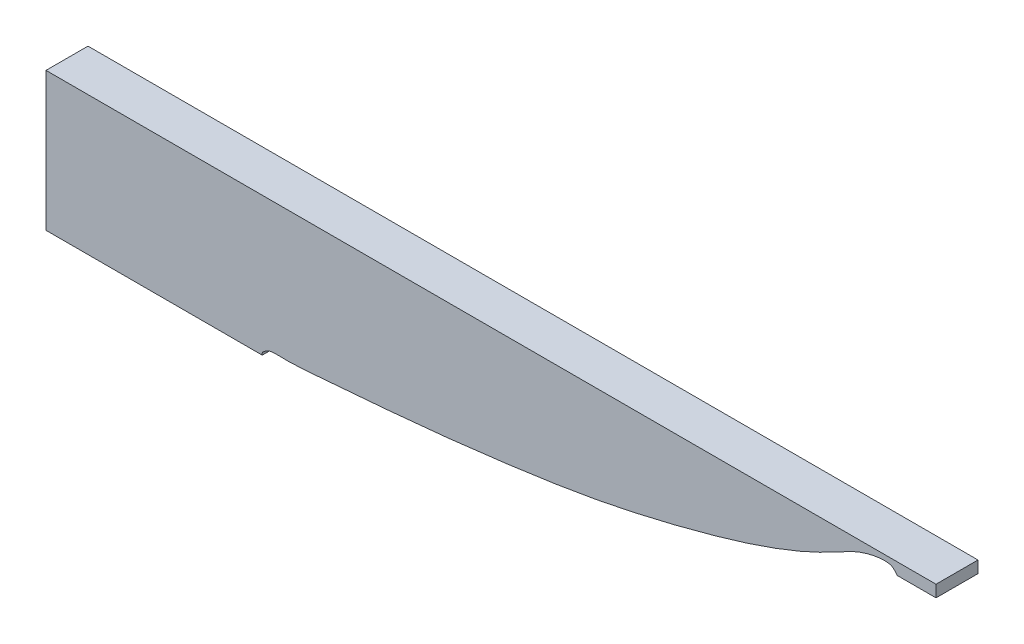
ISO-10303-21;
HEADER;
FILE_DESCRIPTION(('STEP AP214'),'2;1');
FILE_NAME('part.step','',(''),(''),'','','');
FILE_SCHEMA(('AUTOMOTIVE_DESIGN { 1 0 10303 214 1 1 1 1 }'));
ENDSEC;
DATA;
#1=APPLICATION_CONTEXT('core data for automotive mechanical design processes');
#2=APPLICATION_PROTOCOL_DEFINITION('international standard','automotive_design',2000,#1);
#3=PRODUCT_CONTEXT('',#1,'mechanical');
#4=PRODUCT('Part','Part','',(#3));
#5=PRODUCT_RELATED_PRODUCT_CATEGORY('part','',(#4));
#6=PRODUCT_DEFINITION_FORMATION('','',#4);
#7=PRODUCT_DEFINITION_CONTEXT('part definition',#1,'design');
#8=PRODUCT_DEFINITION('design','',#6,#7);
#9=PRODUCT_DEFINITION_SHAPE('','',#8);
#10=(LENGTH_UNIT() NAMED_UNIT(*) SI_UNIT(.MILLI.,.METRE.));
#11=(NAMED_UNIT(*) PLANE_ANGLE_UNIT() SI_UNIT($,.RADIAN.));
#12=(NAMED_UNIT(*) SI_UNIT($,.STERADIAN.) SOLID_ANGLE_UNIT());
#13=UNCERTAINTY_MEASURE_WITH_UNIT(LENGTH_MEASURE(1.E-05),#10,'distance_accuracy_value','');
#14=(GEOMETRIC_REPRESENTATION_CONTEXT(3) GLOBAL_UNCERTAINTY_ASSIGNED_CONTEXT((#13)) GLOBAL_UNIT_ASSIGNED_CONTEXT((#10,
#11,#12)) REPRESENTATION_CONTEXT('',''));
#15=CARTESIAN_POINT('',(0.,0.,0.));
#16=DIRECTION('',(0.,0.,1.));
#17=DIRECTION('',(1.,0.,0.));
#18=AXIS2_PLACEMENT_3D('',#15,#16,#17);
#19=CARTESIAN_POINT('',(-52.949019746504,-24.1447954127009,380.));
#20=CARTESIAN_POINT('',(-52.9645912690891,-24.0636870278323,380.));
#21=CARTESIAN_POINT('',(-52.9783340736109,-23.9816324531939,380.));
#22=CARTESIAN_POINT('',(-52.9706783281911,-23.8172747566796,380.));
#23=CARTESIAN_POINT('',(-52.9498647700014,-23.7356268511588,380.));
#24=CARTESIAN_POINT('',(-52.8721858628388,-23.5884918411596,380.));
#25=CARTESIAN_POINT('',(-52.8145393103514,-23.5281535278229,380.));
#26=CARTESIAN_POINT('',(-52.687959603608,-23.4211056938656,380.));
#27=CARTESIAN_POINT('',(-52.6222075283378,-23.3706398008123,380.));
#28=CARTESIAN_POINT('',(-52.4254051263337,-23.2186784827459,380.));
#29=CARTESIAN_POINT('',(-52.2901695526242,-23.1238753533858,380.));
#30=CARTESIAN_POINT('',(-52.0067089254694,-22.9558595882656,380.));
#31=CARTESIAN_POINT('',(-51.8547406035593,-22.8844174078812,380.));
#32=CARTESIAN_POINT('',(-51.3881074748697,-22.7252156486458,380.));
#33=CARTESIAN_POINT('',(-51.0676899061673,-22.6814838793278,380.));
#34=CARTESIAN_POINT('',(-50.4203854515145,-22.6372951883515,380.));
#35=CARTESIAN_POINT('',(-50.093101803306,-22.6368332538936,380.));
#36=CARTESIAN_POINT('',(-49.4400787308051,-22.6509629684589,380.));
#37=CARTESIAN_POINT('',(-49.1136071780461,-22.6654536250301,380.));
#38=CARTESIAN_POINT('',(-48.4605900439447,-22.6806862288433,380.));
#39=CARTESIAN_POINT('',(-48.1340486234984,-22.682200944514,380.));
#40=CARTESIAN_POINT('',(-47.1543429319933,-22.6716217481724,380.));
#41=CARTESIAN_POINT('',(-46.5009870407512,-22.6435335840744,380.));
#42=CARTESIAN_POINT('',(-45.1969798551708,-22.5629710426898,380.));
#43=CARTESIAN_POINT('',(-44.545661212306,-22.5134619438665,380.));
#44=CARTESIAN_POINT('',(-43.2430760340175,-22.4137417408711,380.));
#45=CARTESIAN_POINT('',(-42.5917705449198,-22.3640554309883,380.));
#46=CARTESIAN_POINT('',(-40.6381331215075,-22.2112371477301,380.));
#47=CARTESIAN_POINT('',(-39.3360688295029,-22.1044935349883,380.));
#48=CARTESIAN_POINT('',(-32.8260603511076,-21.5666184848091,380.));
#49=CARTESIAN_POINT('',(-27.6182933546563,-21.1314911138405,380.));
#50=CARTESIAN_POINT('',(-17.2170674989237,-20.1073901870455,380.));
#51=CARTESIAN_POINT('',(-12.0267850111085,-19.5065563707483,380.));
#52=CARTESIAN_POINT('',(-4.2542711624366,-18.4943536735754,380.));
#53=CARTESIAN_POINT('',(-1.66545428860403,-18.1404049933179,380.));
#54=CARTESIAN_POINT('',(3.50340474874371,-17.3803362165602,380.));
#55=CARTESIAN_POINT('',(6.08327960077433,-16.9716569206224,380.));
#56=CARTESIAN_POINT('',(11.2286586281222,-16.063919221284,380.));
#57=CARTESIAN_POINT('',(13.7946101630884,-15.5638474164313,380.));
#58=CARTESIAN_POINT('',(18.9057007183737,-14.472819964058,380.));
#59=CARTESIAN_POINT('',(21.4526267671476,-13.8845061635789,380.));
#60=CARTESIAN_POINT('',(26.5289285689656,-12.6443533414224,380.));
#61=CARTESIAN_POINT('',(29.0580536465566,-11.9906744816496,380.));
#62=CARTESIAN_POINT('',(34.0954626951996,-10.6057269192127,380.));
#63=CARTESIAN_POINT('',(36.605290091433,-9.87693392129115,380.));
#64=CARTESIAN_POINT('',(40.3423490162058,-8.69142484544807,380.));
#65=CARTESIAN_POINT('',(41.5825310771516,-8.28043252969644,380.));
#66=CARTESIAN_POINT('',(44.0489058536023,-7.41823383482976,380.));
#67=CARTESIAN_POINT('',(45.2748866618424,-6.96641830268353,380.));
#68=CARTESIAN_POINT('',(47.7123296845966,-6.02105178689876,380.));
#69=CARTESIAN_POINT('',(48.9226664967179,-5.52877038217965,380.));
#70=CARTESIAN_POINT('',(51.3195996201476,-4.49197320138995,380.));
#71=CARTESIAN_POINT('',(52.506182315591,-3.94701417441342,380.));
#72=CARTESIAN_POINT('',(54.259392322257,-3.06998152254813,380.));
#73=CARTESIAN_POINT('',(54.8394166716251,-2.76784053915766,380.));
#74=CARTESIAN_POINT('',(55.9946560235012,-2.15287509572423,380.));
#75=CARTESIAN_POINT('',(56.569189318796,-1.83852909973505,380.));
#76=CARTESIAN_POINT('',(58.2963630237748,-0.903438317080811,380.));
#77=CARTESIAN_POINT('',(59.4541629557831,-0.294166910052449,380.));
#78=CARTESIAN_POINT('',(61.2801281517405,0.421238364975446,380.));
#79=CARTESIAN_POINT('',(61.9043494038348,0.625091808374285,380.));
#80=CARTESIAN_POINT('',(62.865321750212,0.876078248639292,380.));
#81=CARTESIAN_POINT('',(63.1904463358963,0.950976114620168,380.));
#82=CARTESIAN_POINT('',(63.8415259259031,1.07947688068065,380.));
#83=CARTESIAN_POINT('',(64.16826864133,1.13300837863068,380.));
#84=CARTESIAN_POINT('',(64.8244284922855,1.2162403702801,380.));
#85=CARTESIAN_POINT('',(65.1537841661319,1.24648853171789,380.));
#86=CARTESIAN_POINT('',(65.6519501864862,1.25503714492772,380.));
#87=CARTESIAN_POINT('',(65.818712170684,1.25189484628573,380.));
#88=CARTESIAN_POINT('',(66.1537239098225,1.23112673587303,380.));
#89=CARTESIAN_POINT('',(66.3198036155557,1.2130203197575,380.));
#90=CARTESIAN_POINT('',(66.6468459342191,1.14909956475373,380.));
#91=CARTESIAN_POINT('',(66.8103668888083,1.10174126855025,380.));
#92=CARTESIAN_POINT('',(67.1136257992309,0.96086727371898,380.));
#93=CARTESIAN_POINT('',(67.2501190198306,0.864637506478759,380.));
#94=CARTESIAN_POINT('',(67.5049571413323,0.644269511758586,380.));
#95=CARTESIAN_POINT('',(67.6200856823165,0.521855441460056,380.));
#96=CARTESIAN_POINT('',(67.7984435420292,0.343871522595573,380.));
#97=CARTESIAN_POINT('',(67.8581428400201,0.284789014523462,380.));
#98=CARTESIAN_POINT('',(67.9656467641969,0.15478782655606,380.));
#99=CARTESIAN_POINT('',(68.010579937875,0.0822474434563318,380.));
#100=CARTESIAN_POINT('',(68.0311786236476,0.,380.));
#101=B_SPLINE_CURVE_WITH_KNOTS('',3,(#19,#20,#21,#22,#23,#24,#25,#26,#27,#28,#29,#30,#31,#32,
#33,#34,#35,#36,#37,#38,#39,#40,#41,#42,#43,#44,#45,#46,#47,#48,#49,#50,#51,#52,#53,#54,#55,#56,
#57,#58,#59,#60,#61,#62,#63,#64,#65,#66,#67,#68,#69,#70,#71,#72,#73,#74,#75,#76,#77,#78,#79,#80,
#81,#82,#83,#84,#85,#86,#87,#88,#89,#90,#91,#92,#93,#94,#95,#96,#97,#98,#99,#100),.UNSPECIFIED.,
.F.,.F.,(4,2,2,2,2,2,2,2,2,2,2,2,2,2,2,2,2,2,2,2,2,2,2,2,2,2,2,2,2,2,2,2,2,2,2,2,2,2,2,2,4),(0.,
0.001953125,0.00390625,0.005859375,0.0078125,0.01171875,0.015625,0.0234375,0.0312500000000001,
0.0390625000000001,0.0468750000000001,0.0625000000000001,0.0781250000000002,0.0937500000000002,
0.125,0.25,0.375,0.437499999999999,0.499999999999999,0.562499999999999,0.624999999999999,
0.687499999999999,0.749999999999999,0.781249999999999,0.812499999999998,0.843749999999998,
0.874999999999998,0.890624999999998,0.906249999999998,0.937499999999998,0.953124999999998,
0.960937499999998,0.968749999999998,0.976562499999999,0.980468749999999,0.984374999999999,
0.988281249999999,0.9921875,0.99609375,0.998046875,1.),.UNSPECIFIED.);
#102=DIRECTION('',(0.,0.,-1.));
#103=VECTOR('',#102,1.);
#104=SURFACE_OF_LINEAR_EXTRUSION('',#101,#103);
#105=CARTESIAN_POINT('',(-52.949019746504,-24.1447954127009,372.));
#106=CARTESIAN_POINT('',(-52.9645912690891,-24.0636870278323,372.));
#107=CARTESIAN_POINT('',(-52.9783340736109,-23.9816324531939,372.));
#108=CARTESIAN_POINT('',(-52.9706783281911,-23.8172747566796,372.));
#109=CARTESIAN_POINT('',(-52.9498647700014,-23.7356268511588,372.));
#110=CARTESIAN_POINT('',(-52.8721858628388,-23.5884918411596,372.));
#111=CARTESIAN_POINT('',(-52.8145393103514,-23.5281535278229,372.));
#112=CARTESIAN_POINT('',(-52.687959603608,-23.4211056938656,372.));
#113=CARTESIAN_POINT('',(-52.6222075283378,-23.3706398008123,372.));
#114=CARTESIAN_POINT('',(-52.4254051263337,-23.2186784827459,372.));
#115=CARTESIAN_POINT('',(-52.2901695526242,-23.1238753533858,372.));
#116=CARTESIAN_POINT('',(-52.0067089254694,-22.9558595882656,372.));
#117=CARTESIAN_POINT('',(-51.8547406035593,-22.8844174078812,372.));
#118=CARTESIAN_POINT('',(-51.3881074748697,-22.7252156486458,372.));
#119=CARTESIAN_POINT('',(-51.0676899061673,-22.6814838793278,372.));
#120=CARTESIAN_POINT('',(-50.4203854515145,-22.6372951883515,372.));
#121=CARTESIAN_POINT('',(-50.093101803306,-22.6368332538936,372.));
#122=CARTESIAN_POINT('',(-49.4400787308051,-22.6509629684589,372.));
#123=CARTESIAN_POINT('',(-49.1136071780461,-22.6654536250301,372.));
#124=CARTESIAN_POINT('',(-48.4605900439447,-22.6806862288433,372.));
#125=CARTESIAN_POINT('',(-48.1340486234984,-22.682200944514,372.));
#126=CARTESIAN_POINT('',(-47.1543429319933,-22.6716217481724,372.));
#127=CARTESIAN_POINT('',(-46.5009870407512,-22.6435335840744,372.));
#128=CARTESIAN_POINT('',(-45.1969798551708,-22.5629710426898,372.));
#129=CARTESIAN_POINT('',(-44.545661212306,-22.5134619438665,372.));
#130=CARTESIAN_POINT('',(-43.2430760340175,-22.4137417408711,372.));
#131=CARTESIAN_POINT('',(-42.5917705449198,-22.3640554309883,372.));
#132=CARTESIAN_POINT('',(-40.6381331215075,-22.2112371477301,372.));
#133=CARTESIAN_POINT('',(-39.3360688295029,-22.1044935349883,372.));
#134=CARTESIAN_POINT('',(-32.8260603511076,-21.5666184848091,372.));
#135=CARTESIAN_POINT('',(-27.6182933546563,-21.1314911138405,372.));
#136=CARTESIAN_POINT('',(-17.2170674989237,-20.1073901870455,372.));
#137=CARTESIAN_POINT('',(-12.0267850111085,-19.5065563707483,372.));
#138=CARTESIAN_POINT('',(-4.2542711624366,-18.4943536735754,372.));
#139=CARTESIAN_POINT('',(-1.66545428860403,-18.1404049933179,372.));
#140=CARTESIAN_POINT('',(3.50340474874371,-17.3803362165602,372.));
#141=CARTESIAN_POINT('',(6.08327960077433,-16.9716569206224,372.));
#142=CARTESIAN_POINT('',(11.2286586281222,-16.063919221284,372.));
#143=CARTESIAN_POINT('',(13.7946101630884,-15.5638474164313,372.));
#144=CARTESIAN_POINT('',(18.9057007183737,-14.472819964058,372.));
#145=CARTESIAN_POINT('',(21.4526267671476,-13.8845061635789,372.));
#146=CARTESIAN_POINT('',(26.5289285689656,-12.6443533414224,372.));
#147=CARTESIAN_POINT('',(29.0580536465566,-11.9906744816496,372.));
#148=CARTESIAN_POINT('',(34.0954626951996,-10.6057269192127,372.));
#149=CARTESIAN_POINT('',(36.605290091433,-9.87693392129115,372.));
#150=CARTESIAN_POINT('',(40.3423490162058,-8.69142484544807,372.));
#151=CARTESIAN_POINT('',(41.5825310771516,-8.28043252969644,372.));
#152=CARTESIAN_POINT('',(44.0489058536023,-7.41823383482976,372.));
#153=CARTESIAN_POINT('',(45.2748866618424,-6.96641830268353,372.));
#154=CARTESIAN_POINT('',(47.7123296845966,-6.02105178689876,372.));
#155=CARTESIAN_POINT('',(48.9226664967179,-5.52877038217965,372.));
#156=CARTESIAN_POINT('',(51.3195996201476,-4.49197320138995,372.));
#157=CARTESIAN_POINT('',(52.506182315591,-3.94701417441342,372.));
#158=CARTESIAN_POINT('',(54.259392322257,-3.06998152254813,372.));
#159=CARTESIAN_POINT('',(54.8394166716251,-2.76784053915766,372.));
#160=CARTESIAN_POINT('',(55.9946560235012,-2.15287509572423,372.));
#161=CARTESIAN_POINT('',(56.569189318796,-1.83852909973505,372.));
#162=CARTESIAN_POINT('',(58.2963630237748,-0.903438317080811,372.));
#163=CARTESIAN_POINT('',(59.4541629557831,-0.294166910052449,372.));
#164=CARTESIAN_POINT('',(61.2801281517405,0.421238364975446,372.));
#165=CARTESIAN_POINT('',(61.9043494038348,0.625091808374285,372.));
#166=CARTESIAN_POINT('',(62.865321750212,0.876078248639292,372.));
#167=CARTESIAN_POINT('',(63.1904463358963,0.950976114620168,372.));
#168=CARTESIAN_POINT('',(63.8415259259031,1.07947688068065,372.));
#169=CARTESIAN_POINT('',(64.16826864133,1.13300837863068,372.));
#170=CARTESIAN_POINT('',(64.8244284922855,1.2162403702801,372.));
#171=CARTESIAN_POINT('',(65.1537841661319,1.24648853171789,372.));
#172=CARTESIAN_POINT('',(65.6519501864862,1.25503714492772,372.));
#173=CARTESIAN_POINT('',(65.818712170684,1.25189484628573,372.));
#174=CARTESIAN_POINT('',(66.1537239098225,1.23112673587303,372.));
#175=CARTESIAN_POINT('',(66.3198036155557,1.2130203197575,372.));
#176=CARTESIAN_POINT('',(66.6468459342191,1.14909956475373,372.));
#177=CARTESIAN_POINT('',(66.8103668888083,1.10174126855025,372.));
#178=CARTESIAN_POINT('',(67.1136257992309,0.96086727371898,372.));
#179=CARTESIAN_POINT('',(67.2501190198306,0.864637506478759,372.));
#180=CARTESIAN_POINT('',(67.5049571413323,0.644269511758586,372.));
#181=CARTESIAN_POINT('',(67.6200856823165,0.521855441460056,372.));
#182=CARTESIAN_POINT('',(67.7984435420292,0.343871522595573,372.));
#183=CARTESIAN_POINT('',(67.8581428400201,0.284789014523462,372.));
#184=CARTESIAN_POINT('',(67.9656467641969,0.15478782655606,372.));
#185=CARTESIAN_POINT('',(68.010579937875,0.0822474434563318,372.));
#186=CARTESIAN_POINT('',(68.0311786236476,0.,372.));
#187=B_SPLINE_CURVE_WITH_KNOTS('',3,(#105,#106,#107,#108,#109,#110,#111,#112,#113,#114,#115,
#116,#117,#118,#119,#120,#121,#122,#123,#124,#125,#126,#127,#128,#129,#130,#131,#132,#133,#134,
#135,#136,#137,#138,#139,#140,#141,#142,#143,#144,#145,#146,#147,#148,#149,#150,#151,#152,#153,
#154,#155,#156,#157,#158,#159,#160,#161,#162,#163,#164,#165,#166,#167,#168,#169,#170,#171,#172,
#173,#174,#175,#176,#177,#178,#179,#180,#181,#182,#183,#184,#185,#186),.UNSPECIFIED.,.F.,.F.,(4,
2,2,2,2,2,2,2,2,2,2,2,2,2,2,2,2,2,2,2,2,2,2,2,2,2,2,2,2,2,2,2,2,2,2,2,2,2,2,2,4),(0.,
0.001953125,0.00390625,0.005859375,0.0078125,0.01171875,0.015625,0.0234375,0.0312500000000001,
0.0390625000000001,0.0468750000000001,0.0625000000000001,0.0781250000000002,0.0937500000000002,
0.125,0.25,0.375,0.437499999999999,0.499999999999999,0.562499999999999,0.624999999999999,
0.687499999999999,0.749999999999999,0.781249999999999,0.812499999999998,0.843749999999998,
0.874999999999998,0.890624999999998,0.906249999999998,0.937499999999998,0.953124999999998,
0.960937499999998,0.968749999999998,0.976562499999999,0.980468749999999,0.984374999999999,
0.988281249999999,0.9921875,0.99609375,0.998046875,1.),.UNSPECIFIED.);
#188=CARTESIAN_POINT('',(-52.949019746504,-24.1447954127009,372.));
#189=VERTEX_POINT('',#188);
#190=CARTESIAN_POINT('',(68.0311786236475,0.,372.));
#191=VERTEX_POINT('',#190);
#192=EDGE_CURVE('E208',#189,#191,#187,.T.);
#193=ORIENTED_EDGE('',*,*,#192,.T.);
#194=DIRECTION('',(0.,0.,-1.));
#195=VECTOR('',#194,1.);
#196=CARTESIAN_POINT('',(68.0311786236475,0.,380.));
#197=LINE('',#196,#195);
#198=CARTESIAN_POINT('',(68.0311786236475,0.,380.));
#199=VERTEX_POINT('',#198);
#200=EDGE_CURVE('E11',#199,#191,#197,.T.);
#201=ORIENTED_EDGE('',*,*,#200,.F.);
#202=CARTESIAN_POINT('',(68.0311786236476,0.,380.));
#203=CARTESIAN_POINT('',(68.010579937875,0.0822474434563318,380.));
#204=CARTESIAN_POINT('',(67.9656467641969,0.15478782655606,380.));
#205=CARTESIAN_POINT('',(67.8581428400201,0.284789014523462,380.));
#206=CARTESIAN_POINT('',(67.7984435420292,0.343871522595573,380.));
#207=CARTESIAN_POINT('',(67.6200856823165,0.521855441460056,380.));
#208=CARTESIAN_POINT('',(67.5049571413323,0.644269511758586,380.));
#209=CARTESIAN_POINT('',(67.2501190198306,0.864637506478759,380.));
#210=CARTESIAN_POINT('',(67.1136257992309,0.96086727371898,380.));
#211=CARTESIAN_POINT('',(66.8103668888083,1.10174126855025,380.));
#212=CARTESIAN_POINT('',(66.6468459342191,1.14909956475373,380.));
#213=CARTESIAN_POINT('',(66.3198036155557,1.2130203197575,380.));
#214=CARTESIAN_POINT('',(66.1537239098225,1.23112673587303,380.));
#215=CARTESIAN_POINT('',(65.818712170684,1.25189484628573,380.));
#216=CARTESIAN_POINT('',(65.6519501864862,1.25503714492772,380.));
#217=CARTESIAN_POINT('',(65.1537841661319,1.24648853171789,380.));
#218=CARTESIAN_POINT('',(64.8244284922855,1.2162403702801,380.));
#219=CARTESIAN_POINT('',(64.16826864133,1.13300837863068,380.));
#220=CARTESIAN_POINT('',(63.8415259259031,1.07947688068065,380.));
#221=CARTESIAN_POINT('',(63.1904463358963,0.950976114620168,380.));
#222=CARTESIAN_POINT('',(62.865321750212,0.876078248639292,380.));
#223=CARTESIAN_POINT('',(61.9043494038348,0.625091808374285,380.));
#224=CARTESIAN_POINT('',(61.2801281517405,0.421238364975446,380.));
#225=CARTESIAN_POINT('',(59.4541629557831,-0.294166910052449,380.));
#226=CARTESIAN_POINT('',(58.2963630237748,-0.903438317080811,380.));
#227=CARTESIAN_POINT('',(56.569189318796,-1.83852909973505,380.));
#228=CARTESIAN_POINT('',(55.9946560235012,-2.15287509572423,380.));
#229=CARTESIAN_POINT('',(54.8394166716251,-2.76784053915766,380.));
#230=CARTESIAN_POINT('',(54.259392322257,-3.06998152254813,380.));
#231=CARTESIAN_POINT('',(52.506182315591,-3.94701417441342,380.));
#232=CARTESIAN_POINT('',(51.3195996201476,-4.49197320138995,380.));
#233=CARTESIAN_POINT('',(48.9226664967179,-5.52877038217965,380.));
#234=CARTESIAN_POINT('',(47.7123296845966,-6.02105178689876,380.));
#235=CARTESIAN_POINT('',(45.2748866618424,-6.96641830268353,380.));
#236=CARTESIAN_POINT('',(44.0489058536023,-7.41823383482976,380.));
#237=CARTESIAN_POINT('',(41.5825310771516,-8.28043252969644,380.));
#238=CARTESIAN_POINT('',(40.3423490162058,-8.69142484544807,380.));
#239=CARTESIAN_POINT('',(36.605290091433,-9.87693392129115,380.));
#240=CARTESIAN_POINT('',(34.0954626951996,-10.6057269192127,380.));
#241=CARTESIAN_POINT('',(29.0580536465566,-11.9906744816496,380.));
#242=CARTESIAN_POINT('',(26.5289285689656,-12.6443533414224,380.));
#243=CARTESIAN_POINT('',(21.4526267671476,-13.8845061635789,380.));
#244=CARTESIAN_POINT('',(18.9057007183737,-14.472819964058,380.));
#245=CARTESIAN_POINT('',(13.7946101630884,-15.5638474164313,380.));
#246=CARTESIAN_POINT('',(11.2286586281222,-16.063919221284,380.));
#247=CARTESIAN_POINT('',(6.08327960077433,-16.9716569206224,380.));
#248=CARTESIAN_POINT('',(3.50340474874371,-17.3803362165602,380.));
#249=CARTESIAN_POINT('',(-1.66545428860403,-18.1404049933179,380.));
#250=CARTESIAN_POINT('',(-4.2542711624366,-18.4943536735754,380.));
#251=CARTESIAN_POINT('',(-12.0267850111085,-19.5065563707483,380.));
#252=CARTESIAN_POINT('',(-17.2170674989237,-20.1073901870455,380.));
#253=CARTESIAN_POINT('',(-27.6182933546563,-21.1314911138405,380.));
#254=CARTESIAN_POINT('',(-32.8260603511076,-21.5666184848091,380.));
#255=CARTESIAN_POINT('',(-39.3360688295029,-22.1044935349883,380.));
#256=CARTESIAN_POINT('',(-40.6381331215075,-22.2112371477301,380.));
#257=CARTESIAN_POINT('',(-42.5917705449198,-22.3640554309883,380.));
#258=CARTESIAN_POINT('',(-43.2430760340175,-22.4137417408711,380.));
#259=CARTESIAN_POINT('',(-44.545661212306,-22.5134619438665,380.));
#260=CARTESIAN_POINT('',(-45.1969798551708,-22.5629710426898,380.));
#261=CARTESIAN_POINT('',(-46.5009870407512,-22.6435335840744,380.));
#262=CARTESIAN_POINT('',(-47.1543429319933,-22.6716217481724,380.));
#263=CARTESIAN_POINT('',(-48.1340486234984,-22.682200944514,380.));
#264=CARTESIAN_POINT('',(-48.4605900439447,-22.6806862288433,380.));
#265=CARTESIAN_POINT('',(-49.1136071780461,-22.6654536250301,380.));
#266=CARTESIAN_POINT('',(-49.4400787308051,-22.6509629684589,380.));
#267=CARTESIAN_POINT('',(-50.093101803306,-22.6368332538936,380.));
#268=CARTESIAN_POINT('',(-50.4203854515145,-22.6372951883515,380.));
#269=CARTESIAN_POINT('',(-51.0676899061673,-22.6814838793278,380.));
#270=CARTESIAN_POINT('',(-51.3881074748697,-22.7252156486458,380.));
#271=CARTESIAN_POINT('',(-51.8547406035593,-22.8844174078812,380.));
#272=CARTESIAN_POINT('',(-52.0067089254694,-22.9558595882656,380.));
#273=CARTESIAN_POINT('',(-52.2901695526242,-23.1238753533858,380.));
#274=CARTESIAN_POINT('',(-52.4254051263337,-23.2186784827459,380.));
#275=CARTESIAN_POINT('',(-52.6222075283378,-23.3706398008123,380.));
#276=CARTESIAN_POINT('',(-52.687959603608,-23.4211056938656,380.));
#277=CARTESIAN_POINT('',(-52.8145393103514,-23.5281535278229,380.));
#278=CARTESIAN_POINT('',(-52.8721858628388,-23.5884918411596,380.));
#279=CARTESIAN_POINT('',(-52.9498647700014,-23.7356268511588,380.));
#280=CARTESIAN_POINT('',(-52.9706783281911,-23.8172747566796,380.));
#281=CARTESIAN_POINT('',(-52.9783340736109,-23.9816324531939,380.));
#282=CARTESIAN_POINT('',(-52.9645912690891,-24.0636870278323,380.));
#283=CARTESIAN_POINT('',(-52.949019746504,-24.1447954127009,380.));
#284=B_SPLINE_CURVE_WITH_KNOTS('',3,(#202,#203,#204,#205,#206,#207,#208,#209,#210,#211,#212,
#213,#214,#215,#216,#217,#218,#219,#220,#221,#222,#223,#224,#225,#226,#227,#228,#229,#230,#231,
#232,#233,#234,#235,#236,#237,#238,#239,#240,#241,#242,#243,#244,#245,#246,#247,#248,#249,#250,
#251,#252,#253,#254,#255,#256,#257,#258,#259,#260,#261,#262,#263,#264,#265,#266,#267,#268,#269,
#270,#271,#272,#273,#274,#275,#276,#277,#278,#279,#280,#281,#282,#283),.UNSPECIFIED.,.F.,.F.,(4,
2,2,2,2,2,2,2,2,2,2,2,2,2,2,2,2,2,2,2,2,2,2,2,2,2,2,2,2,2,2,2,2,2,2,2,2,2,2,2,4),(0.,
0.00195312500000011,0.00390625000000022,0.00781250000000044,0.0117187500000007,
0.0156250000000009,0.0195312500000011,0.0234375000000013,0.0312500000000016,0.0390625000000017,
0.0468750000000018,0.0625000000000018,0.0937500000000018,0.109375000000002,0.125000000000002,
0.156250000000002,0.187500000000002,0.218750000000001,0.250000000000001,0.312500000000001,
0.375000000000001,0.437500000000001,0.500000000000001,0.562500000000001,0.625,0.75,0.875,
0.90625,0.921875,0.9375,0.953125,0.9609375,0.96875,0.9765625,0.984375,0.98828125,0.9921875,
0.994140625,0.99609375,0.998046875,1.),.UNSPECIFIED.);
#285=CARTESIAN_POINT('',(-52.949019746504,-24.1447954127009,380.));
#286=VERTEX_POINT('',#285);
#287=EDGE_CURVE('E191',#286,#199,#284,.F.);
#288=ORIENTED_EDGE('',*,*,#287,.F.);
#289=DIRECTION('',(0.,0.,-1.));
#290=VECTOR('',#289,1.);
#291=CARTESIAN_POINT('',(-52.949019746504,-24.1447954127009,380.));
#292=LINE('',#291,#290);
#293=EDGE_CURVE('E116',#286,#189,#292,.T.);
#294=ORIENTED_EDGE('',*,*,#293,.T.);
#295=EDGE_LOOP('',(#193,#201,#288,#294));
#296=FACE_BOUND('',#295,.T.);
#297=ADVANCED_FACE('F30',(#296),#104,.F.);
#298=CARTESIAN_POINT('',(68.0311786236475,0.,380.));
#299=DIRECTION('',(0.,1.,0.));
#300=DIRECTION('',(-1.,0.,0.));
#301=AXIS2_PLACEMENT_3D('',#298,#299,#300);
#302=PLANE('',#301);
#303=DIRECTION('',(1.,0.,0.));
#304=VECTOR('',#303,1.);
#305=CARTESIAN_POINT('',(68.0311786236475,0.,372.));
#306=LINE('',#305,#304);
#307=CARTESIAN_POINT('',(75.4426109594243,0.,372.));
#308=VERTEX_POINT('',#307);
#309=EDGE_CURVE('E161',#191,#308,#306,.T.);
#310=ORIENTED_EDGE('',*,*,#309,.T.);
#311=DIRECTION('',(0.,0.,-1.));
#312=VECTOR('',#311,1.);
#313=CARTESIAN_POINT('',(75.4426109594243,0.,380.));
#314=LINE('',#313,#312);
#315=CARTESIAN_POINT('',(75.4426109594243,0.,380.));
#316=VERTEX_POINT('',#315);
#317=EDGE_CURVE('E41',#316,#308,#314,.T.);
#318=ORIENTED_EDGE('',*,*,#317,.F.);
#319=DIRECTION('',(1.,0.,0.));
#320=VECTOR('',#319,1.);
#321=CARTESIAN_POINT('',(68.0311786236475,0.,380.));
#322=LINE('',#321,#320);
#323=EDGE_CURVE('E89',#199,#316,#322,.T.);
#324=ORIENTED_EDGE('',*,*,#323,.F.);
#325=ORIENTED_EDGE('',*,*,#200,.T.);
#326=EDGE_LOOP('',(#310,#318,#324,#325));
#327=FACE_BOUND('',#326,.T.);
#328=ADVANCED_FACE('F226',(#327),#302,.F.);
#329=CARTESIAN_POINT('',(75.4426109594243,2.25600000000005,380.));
#330=DIRECTION('',(-1.,0.,0.));
#331=DIRECTION('',(0.,0.,1.));
#332=AXIS2_PLACEMENT_3D('',#329,#330,#331);
#333=PLANE('',#332);
#334=DIRECTION('',(0.,1.,0.));
#335=VECTOR('',#334,1.);
#336=CARTESIAN_POINT('',(75.4426109594243,2.25600000000005,372.));
#337=LINE('',#336,#335);
#338=CARTESIAN_POINT('',(75.4426109594243,2.25600000000005,372.));
#339=VERTEX_POINT('',#338);
#340=EDGE_CURVE('E156',#308,#339,#337,.T.);
#341=ORIENTED_EDGE('',*,*,#340,.T.);
#342=DIRECTION('',(0.,0.,-1.));
#343=VECTOR('',#342,1.);
#344=CARTESIAN_POINT('',(75.4426109594243,2.25600000000005,380.));
#345=LINE('',#344,#343);
#346=CARTESIAN_POINT('',(75.4426109594243,2.25600000000005,380.));
#347=VERTEX_POINT('',#346);
#348=EDGE_CURVE('E111',#347,#339,#345,.T.);
#349=ORIENTED_EDGE('',*,*,#348,.F.);
#350=DIRECTION('',(0.,1.,0.));
#351=VECTOR('',#350,1.);
#352=CARTESIAN_POINT('',(75.4426109594243,2.25600000000005,380.));
#353=LINE('',#352,#351);
#354=EDGE_CURVE('E102',#316,#347,#353,.T.);
#355=ORIENTED_EDGE('',*,*,#354,.F.);
#356=ORIENTED_EDGE('',*,*,#317,.T.);
#357=EDGE_LOOP('',(#341,#349,#355,#356));
#358=FACE_BOUND('',#357,.T.);
#359=ADVANCED_FACE('F229',(#358),#333,.F.);
#360=CARTESIAN_POINT('',(75.4426109594243,2.25600000000005,380.));
#361=DIRECTION('',(0.,-1.,0.));
#362=DIRECTION('',(1.,0.,0.));
#363=AXIS2_PLACEMENT_3D('',#360,#361,#362);
#364=PLANE('',#363);
#365=DIRECTION('',(-1.,0.,0.));
#366=VECTOR('',#365,1.);
#367=CARTESIAN_POINT('',(75.4426109594243,2.25600000000005,372.));
#368=LINE('',#367,#366);
#369=CARTESIAN_POINT('',(-94.1582353540513,2.25600000000003,372.));
#370=VERTEX_POINT('',#369);
#371=EDGE_CURVE('E110',#339,#370,#368,.T.);
#372=ORIENTED_EDGE('',*,*,#371,.T.);
#373=DIRECTION('',(0.,0.,-1.));
#374=VECTOR('',#373,1.);
#375=CARTESIAN_POINT('',(-94.1582353540513,2.25600000000003,380.));
#376=LINE('',#375,#374);
#377=CARTESIAN_POINT('',(-94.1582353540513,2.25600000000003,380.));
#378=VERTEX_POINT('',#377);
#379=EDGE_CURVE('E107',#378,#370,#376,.T.);
#380=ORIENTED_EDGE('',*,*,#379,.F.);
#381=DIRECTION('',(-1.,0.,0.));
#382=VECTOR('',#381,1.);
#383=CARTESIAN_POINT('',(75.4426109594243,2.25600000000005,380.));
#384=LINE('',#383,#382);
#385=EDGE_CURVE('E96',#347,#378,#384,.T.);
#386=ORIENTED_EDGE('',*,*,#385,.F.);
#387=ORIENTED_EDGE('',*,*,#348,.T.);
#388=EDGE_LOOP('',(#372,#380,#386,#387));
#389=FACE_BOUND('',#388,.T.);
#390=ADVANCED_FACE('F108',(#389),#364,.F.);
#391=CARTESIAN_POINT('',(-94.1582353540476,-24.1460527868042,380.));
#392=DIRECTION('',(1.,1.39292720864072E-13,0.));
#393=DIRECTION('',(-1.39292720864072E-13,1.,0.));
#394=AXIS2_PLACEMENT_3D('',#391,#392,#393);
#395=PLANE('',#394);
#396=DIRECTION('',(1.39292720864072E-13,-1.,0.));
#397=VECTOR('',#396,1.);
#398=CARTESIAN_POINT('',(-94.1582353540476,-24.1460527868042,372.));
#399=LINE('',#398,#397);
#400=CARTESIAN_POINT('',(-94.1582353540476,-24.1460527868042,372.));
#401=VERTEX_POINT('',#400);
#402=EDGE_CURVE('E74',#370,#401,#399,.T.);
#403=ORIENTED_EDGE('',*,*,#402,.T.);
#404=DIRECTION('',(0.,0.,-1.));
#405=VECTOR('',#404,1.);
#406=CARTESIAN_POINT('',(-94.1582353540476,-24.1460527868042,380.));
#407=LINE('',#406,#405);
#408=CARTESIAN_POINT('',(-94.1582353540476,-24.1460527868042,380.));
#409=VERTEX_POINT('',#408);
#410=EDGE_CURVE('E112',#409,#401,#407,.T.);
#411=ORIENTED_EDGE('',*,*,#410,.F.);
#412=DIRECTION('',(1.39292720864072E-13,-1.,0.));
#413=VECTOR('',#412,1.);
#414=CARTESIAN_POINT('',(-94.1582353540476,-24.1460527868042,380.));
#415=LINE('',#414,#413);
#416=EDGE_CURVE('E100',#378,#409,#415,.T.);
#417=ORIENTED_EDGE('',*,*,#416,.F.);
#418=ORIENTED_EDGE('',*,*,#379,.T.);
#419=EDGE_LOOP('',(#403,#411,#417,#418));
#420=FACE_BOUND('',#419,.T.);
#421=ADVANCED_FACE('F114',(#420),#395,.F.);
#422=CARTESIAN_POINT('',(-94.1582353540513,-24.1460527868091,380.));
#423=CARTESIAN_POINT('',(-80.4218301465433,-24.1458565362693,380.));
#424=CARTESIAN_POINT('',(-66.6854249395791,-24.1454549776582,380.));
#425=CARTESIAN_POINT('',(-52.949019746504,-24.1447954127009,380.));
#426=B_SPLINE_CURVE_WITH_KNOTS('',3,(#422,#423,#424,#425),.UNSPECIFIED.,.F.,.F.,(4,4),(0.,1.),.UNSPECIFIED.);
#427=DIRECTION('',(0.,0.,-1.));
#428=VECTOR('',#427,1.);
#429=SURFACE_OF_LINEAR_EXTRUSION('',#426,#428);
#430=CARTESIAN_POINT('',(-94.1582353540513,-24.1460527868091,372.));
#431=CARTESIAN_POINT('',(-80.4218301465433,-24.1458565362693,372.));
#432=CARTESIAN_POINT('',(-66.6854249395791,-24.1454549776582,372.));
#433=CARTESIAN_POINT('',(-52.949019746504,-24.1447954127009,372.));
#434=B_SPLINE_CURVE_WITH_KNOTS('',3,(#430,#431,#432,#433),.UNSPECIFIED.,.F.,.F.,(4,4),(0.,1.),.UNSPECIFIED.);
#435=EDGE_CURVE('E80',#401,#189,#434,.T.);
#436=ORIENTED_EDGE('',*,*,#435,.T.);
#437=ORIENTED_EDGE('',*,*,#293,.F.);
#438=CARTESIAN_POINT('',(-52.949019746504,-24.1447954127009,380.));
#439=CARTESIAN_POINT('',(-66.6854249395791,-24.1454549776582,380.));
#440=CARTESIAN_POINT('',(-80.4218301465433,-24.1458565362693,380.));
#441=CARTESIAN_POINT('',(-94.1582353540513,-24.1460527868091,380.));
#442=B_SPLINE_CURVE_WITH_KNOTS('',3,(#438,#439,#440,#441),.UNSPECIFIED.,.F.,.F.,(4,4),(0.,1.),.UNSPECIFIED.);
#443=EDGE_CURVE('E50',#409,#286,#442,.F.);
#444=ORIENTED_EDGE('',*,*,#443,.F.);
#445=ORIENTED_EDGE('',*,*,#410,.T.);
#446=EDGE_LOOP('',(#436,#437,#444,#445));
#447=FACE_BOUND('',#446,.T.);
#448=ADVANCED_FACE('F135',(#447),#429,.F.);
#449=CARTESIAN_POINT('',(8.65596911444837,-16.5177880709532,380.));
#450=DIRECTION('',(0.,0.,-1.));
#451=DIRECTION('',(-1.,0.,0.));
#452=AXIS2_PLACEMENT_3D('',#449,#450,#451);
#453=PLANE('',#452);
#454=ORIENTED_EDGE('',*,*,#287,.T.);
#455=ORIENTED_EDGE('',*,*,#323,.T.);
#456=ORIENTED_EDGE('',*,*,#354,.T.);
#457=ORIENTED_EDGE('',*,*,#385,.T.);
#458=ORIENTED_EDGE('',*,*,#416,.T.);
#459=ORIENTED_EDGE('',*,*,#443,.T.);
#460=EDGE_LOOP('',(#454,#455,#456,#457,#458,#459));
#461=FACE_BOUND('',#460,.T.);
#462=ADVANCED_FACE('F98',(#461),#453,.F.);
#463=CARTESIAN_POINT('',(8.65596911444837,-16.5177880709532,372.));
#464=DIRECTION('',(0.,0.,-1.));
#465=DIRECTION('',(-1.,0.,0.));
#466=AXIS2_PLACEMENT_3D('',#463,#464,#465);
#467=PLANE('',#466);
#468=ORIENTED_EDGE('',*,*,#192,.F.);
#469=ORIENTED_EDGE('',*,*,#435,.F.);
#470=ORIENTED_EDGE('',*,*,#402,.F.);
#471=ORIENTED_EDGE('',*,*,#371,.F.);
#472=ORIENTED_EDGE('',*,*,#340,.F.);
#473=ORIENTED_EDGE('',*,*,#309,.F.);
#474=EDGE_LOOP('',(#468,#469,#470,#471,#472,#473));
#475=FACE_BOUND('',#474,.T.);
#476=ADVANCED_FACE('F146',(#475),#467,.T.);
#477=CLOSED_SHELL('',(#297,#328,#359,#390,#421,#448,#462,#476));
#478=MANIFOLD_SOLID_BREP('B2',#477);
#479=ADVANCED_BREP_SHAPE_REPRESENTATION('',(#18,#478),#14);
#480=SHAPE_DEFINITION_REPRESENTATION(#9,#479);
ENDSEC;
END-ISO-10303-21;
